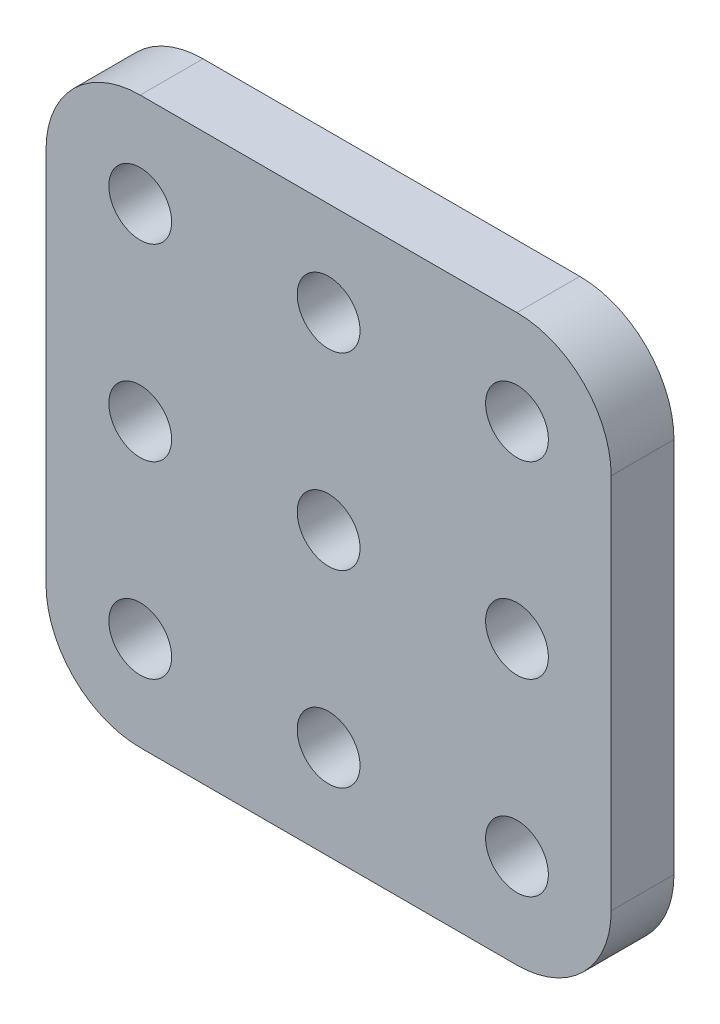
ISO-10303-21;
HEADER;
FILE_DESCRIPTION(('STEP AP214'),'2;1');
FILE_NAME('part.step','',(''),(''),'','','');
FILE_SCHEMA(('AUTOMOTIVE_DESIGN { 1 0 10303 214 1 1 1 1 }'));
ENDSEC;
DATA;
#1=APPLICATION_CONTEXT('core data for automotive mechanical design processes');
#2=APPLICATION_PROTOCOL_DEFINITION('international standard','automotive_design',2000,#1);
#3=PRODUCT_CONTEXT('',#1,'mechanical');
#4=PRODUCT('Part','Part','',(#3));
#5=PRODUCT_RELATED_PRODUCT_CATEGORY('part','',(#4));
#6=PRODUCT_DEFINITION_FORMATION('','',#4);
#7=PRODUCT_DEFINITION_CONTEXT('part definition',#1,'design');
#8=PRODUCT_DEFINITION('design','',#6,#7);
#9=PRODUCT_DEFINITION_SHAPE('','',#8);
#10=(LENGTH_UNIT() NAMED_UNIT(*) SI_UNIT(.MILLI.,.METRE.));
#11=(NAMED_UNIT(*) PLANE_ANGLE_UNIT() SI_UNIT($,.RADIAN.));
#12=(NAMED_UNIT(*) SI_UNIT($,.STERADIAN.) SOLID_ANGLE_UNIT());
#13=UNCERTAINTY_MEASURE_WITH_UNIT(LENGTH_MEASURE(1.E-05),#10,'distance_accuracy_value','');
#14=(GEOMETRIC_REPRESENTATION_CONTEXT(3) GLOBAL_UNCERTAINTY_ASSIGNED_CONTEXT((#13)) GLOBAL_UNIT_ASSIGNED_CONTEXT((#10,
#11,#12)) REPRESENTATION_CONTEXT('',''));
#15=CARTESIAN_POINT('',(0.,0.,0.));
#16=DIRECTION('',(0.,0.,1.));
#17=DIRECTION('',(1.,0.,0.));
#18=AXIS2_PLACEMENT_3D('',#15,#16,#17);
#19=CARTESIAN_POINT('',(-101.443383637,101.056539338,3.));
#20=DIRECTION('',(0.,0.,1.));
#21=DIRECTION('',(1.,0.,0.));
#22=AXIS2_PLACEMENT_3D('',#19,#20,#21);
#23=PLANE('',#22);
#24=CARTESIAN_POINT('',(-92.443383637,83.056539338,3.));
#25=DIRECTION('',(0.,0.,1.));
#26=DIRECTION('',(1.,0.,0.));
#27=AXIS2_PLACEMENT_3D('',#24,#25,#26);
#28=CIRCLE('',#27,1.5);
#29=CARTESIAN_POINT('',(-90.943383637,83.056539338,3.));
#30=VERTEX_POINT('',#29);
#31=EDGE_CURVE('E218',#30,#30,#28,.T.);
#32=ORIENTED_EDGE('',*,*,#31,.F.);
#33=EDGE_LOOP('',(#32));
#34=FACE_BOUND('',#33,.T.);
#35=CARTESIAN_POINT('',(-83.443383637,92.056539338,3.));
#36=DIRECTION('',(0.,0.,1.));
#37=DIRECTION('',(1.,0.,0.));
#38=AXIS2_PLACEMENT_3D('',#35,#36,#37);
#39=CIRCLE('',#38,1.5);
#40=CARTESIAN_POINT('',(-81.943383637,92.056539338,3.));
#41=VERTEX_POINT('',#40);
#42=EDGE_CURVE('E206',#41,#41,#39,.T.);
#43=ORIENTED_EDGE('',*,*,#42,.F.);
#44=EDGE_LOOP('',(#43));
#45=FACE_BOUND('',#44,.T.);
#46=CARTESIAN_POINT('',(-101.443383637,92.056539338,3.));
#47=DIRECTION('',(0.,0.,1.));
#48=DIRECTION('',(1.,0.,0.));
#49=AXIS2_PLACEMENT_3D('',#46,#47,#48);
#50=CIRCLE('',#49,1.5);
#51=CARTESIAN_POINT('',(-99.943383637,92.056539338,3.));
#52=VERTEX_POINT('',#51);
#53=EDGE_CURVE('E194',#52,#52,#50,.T.);
#54=ORIENTED_EDGE('',*,*,#53,.F.);
#55=EDGE_LOOP('',(#54));
#56=FACE_BOUND('',#55,.T.);
#57=CARTESIAN_POINT('',(-92.443383637,101.056539338,3.));
#58=DIRECTION('',(0.,0.,1.));
#59=DIRECTION('',(1.,0.,0.));
#60=AXIS2_PLACEMENT_3D('',#57,#58,#59);
#61=CIRCLE('',#60,1.5);
#62=CARTESIAN_POINT('',(-90.943383637,101.056539338,3.));
#63=VERTEX_POINT('',#62);
#64=EDGE_CURVE('E182',#63,#63,#61,.T.);
#65=ORIENTED_EDGE('',*,*,#64,.F.);
#66=EDGE_LOOP('',(#65));
#67=FACE_BOUND('',#66,.T.);
#68=CARTESIAN_POINT('',(-101.443383637,101.056539338,3.));
#69=DIRECTION('',(0.,0.,1.));
#70=DIRECTION('',(1.,0.,0.));
#71=AXIS2_PLACEMENT_3D('',#68,#69,#70);
#72=CIRCLE('',#71,4.5);
#73=CARTESIAN_POINT('',(-101.443383637,105.556539338,3.));
#74=VERTEX_POINT('',#73);
#75=CARTESIAN_POINT('',(-105.943383637,101.056539338,3.));
#76=VERTEX_POINT('',#75);
#77=EDGE_CURVE('E145',#74,#76,#72,.T.);
#78=ORIENTED_EDGE('',*,*,#77,.T.);
#79=DIRECTION('',(0.,-1.,0.));
#80=VECTOR('',#79,1.);
#81=CARTESIAN_POINT('',(-105.943383637,101.056539338,3.));
#82=LINE('',#81,#80);
#83=CARTESIAN_POINT('',(-105.943383637,83.056539338,3.));
#84=VERTEX_POINT('',#83);
#85=EDGE_CURVE('E93',#76,#84,#82,.T.);
#86=ORIENTED_EDGE('',*,*,#85,.T.);
#87=CARTESIAN_POINT('',(-101.443383637,83.056539338,3.));
#88=DIRECTION('',(0.,0.,1.));
#89=DIRECTION('',(1.,0.,0.));
#90=AXIS2_PLACEMENT_3D('',#87,#88,#89);
#91=CIRCLE('',#90,4.5);
#92=CARTESIAN_POINT('',(-101.443383637,78.556539338,3.));
#93=VERTEX_POINT('',#92);
#94=EDGE_CURVE('E160',#84,#93,#91,.T.);
#95=ORIENTED_EDGE('',*,*,#94,.T.);
#96=DIRECTION('',(1.,0.,0.));
#97=VECTOR('',#96,1.);
#98=CARTESIAN_POINT('',(-101.443383637,78.556539338,3.));
#99=LINE('',#98,#97);
#100=CARTESIAN_POINT('',(-83.443383637,78.556539338,3.));
#101=VERTEX_POINT('',#100);
#102=EDGE_CURVE('E173',#93,#101,#99,.T.);
#103=ORIENTED_EDGE('',*,*,#102,.T.);
#104=CARTESIAN_POINT('',(-83.443383637,83.056539338,3.));
#105=DIRECTION('',(0.,0.,1.));
#106=DIRECTION('',(1.,0.,0.));
#107=AXIS2_PLACEMENT_3D('',#104,#105,#106);
#108=CIRCLE('',#107,4.5);
#109=CARTESIAN_POINT('',(-78.943383637,83.056539338,3.));
#110=VERTEX_POINT('',#109);
#111=EDGE_CURVE('E112',#101,#110,#108,.T.);
#112=ORIENTED_EDGE('',*,*,#111,.T.);
#113=DIRECTION('',(0.,1.,0.));
#114=VECTOR('',#113,1.);
#115=CARTESIAN_POINT('',(-78.943383637,83.056539338,3.));
#116=LINE('',#115,#114);
#117=CARTESIAN_POINT('',(-78.943383637,101.056539338,3.));
#118=VERTEX_POINT('',#117);
#119=EDGE_CURVE('E106',#110,#118,#116,.T.);
#120=ORIENTED_EDGE('',*,*,#119,.T.);
#121=CARTESIAN_POINT('',(-83.443383637,101.056539338,3.));
#122=DIRECTION('',(0.,0.,1.));
#123=DIRECTION('',(1.,0.,0.));
#124=AXIS2_PLACEMENT_3D('',#121,#122,#123);
#125=CIRCLE('',#124,4.5);
#126=CARTESIAN_POINT('',(-83.443383637,105.556539338,3.));
#127=VERTEX_POINT('',#126);
#128=EDGE_CURVE('E110',#118,#127,#125,.T.);
#129=ORIENTED_EDGE('',*,*,#128,.T.);
#130=DIRECTION('',(-1.,0.,0.));
#131=VECTOR('',#130,1.);
#132=CARTESIAN_POINT('',(-83.443383637,105.556539338,3.));
#133=LINE('',#132,#131);
#134=EDGE_CURVE('E50',#127,#74,#133,.T.);
#135=ORIENTED_EDGE('',*,*,#134,.T.);
#136=EDGE_LOOP('',(#78,#86,#95,#103,#112,#120,#129,#135));
#137=FACE_BOUND('',#136,.T.);
#138=CARTESIAN_POINT('',(-101.443383637,101.056539338,3.));
#139=DIRECTION('',(0.,0.,1.));
#140=DIRECTION('',(1.,0.,0.));
#141=AXIS2_PLACEMENT_3D('',#138,#139,#140);
#142=CIRCLE('',#141,1.5);
#143=CARTESIAN_POINT('',(-99.943383637,101.056539338,3.));
#144=VERTEX_POINT('',#143);
#145=EDGE_CURVE('E134',#144,#144,#142,.T.);
#146=ORIENTED_EDGE('',*,*,#145,.F.);
#147=EDGE_LOOP('',(#146));
#148=FACE_BOUND('',#147,.T.);
#149=CARTESIAN_POINT('',(-83.443383637,101.056539338,3.));
#150=DIRECTION('',(0.,0.,1.));
#151=DIRECTION('',(1.,0.,0.));
#152=AXIS2_PLACEMENT_3D('',#149,#150,#151);
#153=CIRCLE('',#152,1.5);
#154=CARTESIAN_POINT('',(-81.943383637,101.056539338,3.));
#155=VERTEX_POINT('',#154);
#156=EDGE_CURVE('E188',#155,#155,#153,.T.);
#157=ORIENTED_EDGE('',*,*,#156,.F.);
#158=EDGE_LOOP('',(#157));
#159=FACE_BOUND('',#158,.T.);
#160=CARTESIAN_POINT('',(-92.443383637,92.056539338,3.));
#161=DIRECTION('',(0.,0.,1.));
#162=DIRECTION('',(1.,0.,0.));
#163=AXIS2_PLACEMENT_3D('',#160,#161,#162);
#164=CIRCLE('',#163,1.5);
#165=CARTESIAN_POINT('',(-90.943383637,92.056539338,3.));
#166=VERTEX_POINT('',#165);
#167=EDGE_CURVE('E200',#166,#166,#164,.T.);
#168=ORIENTED_EDGE('',*,*,#167,.F.);
#169=EDGE_LOOP('',(#168));
#170=FACE_BOUND('',#169,.T.);
#171=CARTESIAN_POINT('',(-101.443383637,83.056539338,3.));
#172=DIRECTION('',(0.,0.,1.));
#173=DIRECTION('',(1.,0.,0.));
#174=AXIS2_PLACEMENT_3D('',#171,#172,#173);
#175=CIRCLE('',#174,1.5);
#176=CARTESIAN_POINT('',(-99.943383637,83.056539338,3.));
#177=VERTEX_POINT('',#176);
#178=EDGE_CURVE('E212',#177,#177,#175,.T.);
#179=ORIENTED_EDGE('',*,*,#178,.F.);
#180=EDGE_LOOP('',(#179));
#181=FACE_BOUND('',#180,.T.);
#182=CARTESIAN_POINT('',(-83.443383637,83.056539338,3.));
#183=DIRECTION('',(0.,0.,1.));
#184=DIRECTION('',(1.,0.,0.));
#185=AXIS2_PLACEMENT_3D('',#182,#183,#184);
#186=CIRCLE('',#185,1.5);
#187=CARTESIAN_POINT('',(-81.943383637,83.056539338,3.));
#188=VERTEX_POINT('',#187);
#189=EDGE_CURVE('E224',#188,#188,#186,.T.);
#190=ORIENTED_EDGE('',*,*,#189,.F.);
#191=EDGE_LOOP('',(#190));
#192=FACE_BOUND('',#191,.T.);
#193=ADVANCED_FACE('F33',(#34,#45,#56,#67,#137,#148,#159,#170,#181,#192),#23,.T.);
#194=CARTESIAN_POINT('',(-101.443383637,101.056539338,0.));
#195=DIRECTION('',(0.,0.,1.));
#196=DIRECTION('',(1.,0.,0.));
#197=AXIS2_PLACEMENT_3D('',#194,#195,#196);
#198=PLANE('',#197);
#199=CARTESIAN_POINT('',(-92.443383637,83.056539338,0.));
#200=DIRECTION('',(0.,0.,1.));
#201=DIRECTION('',(1.,0.,0.));
#202=AXIS2_PLACEMENT_3D('',#199,#200,#201);
#203=CIRCLE('',#202,1.5);
#204=CARTESIAN_POINT('',(-90.943383637,83.056539338,0.));
#205=VERTEX_POINT('',#204);
#206=EDGE_CURVE('E221',#205,#205,#203,.T.);
#207=ORIENTED_EDGE('',*,*,#206,.T.);
#208=EDGE_LOOP('',(#207));
#209=FACE_BOUND('',#208,.T.);
#210=CARTESIAN_POINT('',(-83.443383637,92.056539338,0.));
#211=DIRECTION('',(0.,0.,1.));
#212=DIRECTION('',(1.,0.,0.));
#213=AXIS2_PLACEMENT_3D('',#210,#211,#212);
#214=CIRCLE('',#213,1.5);
#215=CARTESIAN_POINT('',(-81.943383637,92.056539338,0.));
#216=VERTEX_POINT('',#215);
#217=EDGE_CURVE('E209',#216,#216,#214,.T.);
#218=ORIENTED_EDGE('',*,*,#217,.T.);
#219=EDGE_LOOP('',(#218));
#220=FACE_BOUND('',#219,.T.);
#221=CARTESIAN_POINT('',(-101.443383637,92.056539338,0.));
#222=DIRECTION('',(0.,0.,1.));
#223=DIRECTION('',(1.,0.,0.));
#224=AXIS2_PLACEMENT_3D('',#221,#222,#223);
#225=CIRCLE('',#224,1.5);
#226=CARTESIAN_POINT('',(-99.943383637,92.056539338,0.));
#227=VERTEX_POINT('',#226);
#228=EDGE_CURVE('E197',#227,#227,#225,.T.);
#229=ORIENTED_EDGE('',*,*,#228,.T.);
#230=EDGE_LOOP('',(#229));
#231=FACE_BOUND('',#230,.T.);
#232=CARTESIAN_POINT('',(-92.443383637,101.056539338,0.));
#233=DIRECTION('',(0.,0.,1.));
#234=DIRECTION('',(1.,0.,0.));
#235=AXIS2_PLACEMENT_3D('',#232,#233,#234);
#236=CIRCLE('',#235,1.5);
#237=CARTESIAN_POINT('',(-90.943383637,101.056539338,0.));
#238=VERTEX_POINT('',#237);
#239=EDGE_CURVE('E185',#238,#238,#236,.T.);
#240=ORIENTED_EDGE('',*,*,#239,.T.);
#241=EDGE_LOOP('',(#240));
#242=FACE_BOUND('',#241,.T.);
#243=CARTESIAN_POINT('',(-101.443383637,101.056539338,0.));
#244=DIRECTION('',(0.,0.,1.));
#245=DIRECTION('',(1.,0.,0.));
#246=AXIS2_PLACEMENT_3D('',#243,#244,#245);
#247=CIRCLE('',#246,4.5);
#248=CARTESIAN_POINT('',(-101.443383637,105.556539338,0.));
#249=VERTEX_POINT('',#248);
#250=CARTESIAN_POINT('',(-105.943383637,101.056539338,0.));
#251=VERTEX_POINT('',#250);
#252=EDGE_CURVE('E130',#249,#251,#247,.T.);
#253=ORIENTED_EDGE('',*,*,#252,.F.);
#254=DIRECTION('',(-1.,0.,0.));
#255=VECTOR('',#254,1.);
#256=CARTESIAN_POINT('',(-83.443383637,105.556539338,0.));
#257=LINE('',#256,#255);
#258=CARTESIAN_POINT('',(-83.443383637,105.556539338,0.));
#259=VERTEX_POINT('',#258);
#260=EDGE_CURVE('E85',#259,#249,#257,.T.);
#261=ORIENTED_EDGE('',*,*,#260,.F.);
#262=CARTESIAN_POINT('',(-83.443383637,101.056539338,0.));
#263=DIRECTION('',(0.,0.,1.));
#264=DIRECTION('',(1.,0.,0.));
#265=AXIS2_PLACEMENT_3D('',#262,#263,#264);
#266=CIRCLE('',#265,4.5);
#267=CARTESIAN_POINT('',(-78.943383637,101.056539338,0.));
#268=VERTEX_POINT('',#267);
#269=EDGE_CURVE('E79',#268,#259,#266,.T.);
#270=ORIENTED_EDGE('',*,*,#269,.F.);
#271=DIRECTION('',(0.,1.,0.));
#272=VECTOR('',#271,1.);
#273=CARTESIAN_POINT('',(-78.943383637,83.056539338,0.));
#274=LINE('',#273,#272);
#275=CARTESIAN_POINT('',(-78.943383637,83.056539338,0.));
#276=VERTEX_POINT('',#275);
#277=EDGE_CURVE('E120',#276,#268,#274,.T.);
#278=ORIENTED_EDGE('',*,*,#277,.F.);
#279=CARTESIAN_POINT('',(-83.443383637,83.056539338,0.));
#280=DIRECTION('',(0.,0.,1.));
#281=DIRECTION('',(1.,0.,0.));
#282=AXIS2_PLACEMENT_3D('',#279,#280,#281);
#283=CIRCLE('',#282,4.5);
#284=CARTESIAN_POINT('',(-83.443383637,78.556539338,0.));
#285=VERTEX_POINT('',#284);
#286=EDGE_CURVE('E140',#285,#276,#283,.T.);
#287=ORIENTED_EDGE('',*,*,#286,.F.);
#288=DIRECTION('',(1.,0.,0.));
#289=VECTOR('',#288,1.);
#290=CARTESIAN_POINT('',(-101.443383637,78.556539338,0.));
#291=LINE('',#290,#289);
#292=CARTESIAN_POINT('',(-101.443383637,78.556539338,0.));
#293=VERTEX_POINT('',#292);
#294=EDGE_CURVE('E138',#293,#285,#291,.T.);
#295=ORIENTED_EDGE('',*,*,#294,.F.);
#296=CARTESIAN_POINT('',(-101.443383637,83.056539338,0.));
#297=DIRECTION('',(0.,0.,1.));
#298=DIRECTION('',(1.,0.,0.));
#299=AXIS2_PLACEMENT_3D('',#296,#297,#298);
#300=CIRCLE('',#299,4.5);
#301=CARTESIAN_POINT('',(-105.943383637,83.056539338,0.));
#302=VERTEX_POINT('',#301);
#303=EDGE_CURVE('E136',#302,#293,#300,.T.);
#304=ORIENTED_EDGE('',*,*,#303,.F.);
#305=DIRECTION('',(0.,-1.,0.));
#306=VECTOR('',#305,1.);
#307=CARTESIAN_POINT('',(-105.943383637,101.056539338,0.));
#308=LINE('',#307,#306);
#309=EDGE_CURVE('E133',#251,#302,#308,.T.);
#310=ORIENTED_EDGE('',*,*,#309,.F.);
#311=EDGE_LOOP('',(#253,#261,#270,#278,#287,#295,#304,#310));
#312=FACE_BOUND('',#311,.T.);
#313=CARTESIAN_POINT('',(-101.443383637,101.056539338,0.));
#314=DIRECTION('',(0.,0.,1.));
#315=DIRECTION('',(1.,0.,0.));
#316=AXIS2_PLACEMENT_3D('',#313,#314,#315);
#317=CIRCLE('',#316,1.5);
#318=CARTESIAN_POINT('',(-99.943383637,101.056539338,0.));
#319=VERTEX_POINT('',#318);
#320=EDGE_CURVE('E179',#319,#319,#317,.T.);
#321=ORIENTED_EDGE('',*,*,#320,.T.);
#322=EDGE_LOOP('',(#321));
#323=FACE_BOUND('',#322,.T.);
#324=CARTESIAN_POINT('',(-83.443383637,101.056539338,0.));
#325=DIRECTION('',(0.,0.,1.));
#326=DIRECTION('',(1.,0.,0.));
#327=AXIS2_PLACEMENT_3D('',#324,#325,#326);
#328=CIRCLE('',#327,1.5);
#329=CARTESIAN_POINT('',(-81.943383637,101.056539338,0.));
#330=VERTEX_POINT('',#329);
#331=EDGE_CURVE('E191',#330,#330,#328,.T.);
#332=ORIENTED_EDGE('',*,*,#331,.T.);
#333=EDGE_LOOP('',(#332));
#334=FACE_BOUND('',#333,.T.);
#335=CARTESIAN_POINT('',(-92.443383637,92.056539338,0.));
#336=DIRECTION('',(0.,0.,1.));
#337=DIRECTION('',(1.,0.,0.));
#338=AXIS2_PLACEMENT_3D('',#335,#336,#337);
#339=CIRCLE('',#338,1.5);
#340=CARTESIAN_POINT('',(-90.943383637,92.056539338,0.));
#341=VERTEX_POINT('',#340);
#342=EDGE_CURVE('E203',#341,#341,#339,.T.);
#343=ORIENTED_EDGE('',*,*,#342,.T.);
#344=EDGE_LOOP('',(#343));
#345=FACE_BOUND('',#344,.T.);
#346=CARTESIAN_POINT('',(-101.443383637,83.056539338,0.));
#347=DIRECTION('',(0.,0.,1.));
#348=DIRECTION('',(1.,0.,0.));
#349=AXIS2_PLACEMENT_3D('',#346,#347,#348);
#350=CIRCLE('',#349,1.5);
#351=CARTESIAN_POINT('',(-99.943383637,83.056539338,0.));
#352=VERTEX_POINT('',#351);
#353=EDGE_CURVE('E215',#352,#352,#350,.T.);
#354=ORIENTED_EDGE('',*,*,#353,.T.);
#355=EDGE_LOOP('',(#354));
#356=FACE_BOUND('',#355,.T.);
#357=CARTESIAN_POINT('',(-83.443383637,83.056539338,0.));
#358=DIRECTION('',(0.,0.,1.));
#359=DIRECTION('',(1.,0.,0.));
#360=AXIS2_PLACEMENT_3D('',#357,#358,#359);
#361=CIRCLE('',#360,1.5);
#362=CARTESIAN_POINT('',(-81.943383637,83.056539338,0.));
#363=VERTEX_POINT('',#362);
#364=EDGE_CURVE('E227',#363,#363,#361,.T.);
#365=ORIENTED_EDGE('',*,*,#364,.T.);
#366=EDGE_LOOP('',(#365));
#367=FACE_BOUND('',#366,.T.);
#368=ADVANCED_FACE('F164',(#209,#220,#231,#242,#312,#323,#334,#345,#356,#367),#198,.F.);
#369=CARTESIAN_POINT('',(-101.443383637,101.056539338,3.));
#370=DIRECTION('',(0.,0.,-1.));
#371=DIRECTION('',(-1.,0.,0.));
#372=AXIS2_PLACEMENT_3D('',#369,#370,#371);
#373=CYLINDRICAL_SURFACE('',#372,4.5);
#374=ORIENTED_EDGE('',*,*,#252,.T.);
#375=DIRECTION('',(0.,0.,-1.));
#376=VECTOR('',#375,1.);
#377=CARTESIAN_POINT('',(-105.943383637,101.056539338,3.));
#378=LINE('',#377,#376);
#379=EDGE_CURVE('E11',#76,#251,#378,.T.);
#380=ORIENTED_EDGE('',*,*,#379,.F.);
#381=ORIENTED_EDGE('',*,*,#77,.F.);
#382=DIRECTION('',(0.,0.,-1.));
#383=VECTOR('',#382,1.);
#384=CARTESIAN_POINT('',(-101.443383637,105.556539338,3.));
#385=LINE('',#384,#383);
#386=EDGE_CURVE('E126',#74,#249,#385,.T.);
#387=ORIENTED_EDGE('',*,*,#386,.T.);
#388=EDGE_LOOP('',(#374,#380,#381,#387));
#389=FACE_BOUND('',#388,.T.);
#390=ADVANCED_FACE('F35',(#389),#373,.T.);
#391=CARTESIAN_POINT('',(-105.943383637,101.056539338,3.));
#392=DIRECTION('',(1.,0.,0.));
#393=DIRECTION('',(0.,0.,-1.));
#394=AXIS2_PLACEMENT_3D('',#391,#392,#393);
#395=PLANE('',#394);
#396=ORIENTED_EDGE('',*,*,#309,.T.);
#397=DIRECTION('',(0.,0.,-1.));
#398=VECTOR('',#397,1.);
#399=CARTESIAN_POINT('',(-105.943383637,83.056539338,3.));
#400=LINE('',#399,#398);
#401=EDGE_CURVE('E42',#84,#302,#400,.T.);
#402=ORIENTED_EDGE('',*,*,#401,.F.);
#403=ORIENTED_EDGE('',*,*,#85,.F.);
#404=ORIENTED_EDGE('',*,*,#379,.T.);
#405=EDGE_LOOP('',(#396,#402,#403,#404));
#406=FACE_BOUND('',#405,.T.);
#407=ADVANCED_FACE('F262',(#406),#395,.F.);
#408=CARTESIAN_POINT('',(-101.443383637,83.056539338,3.));
#409=DIRECTION('',(0.,0.,-1.));
#410=DIRECTION('',(-1.,0.,0.));
#411=AXIS2_PLACEMENT_3D('',#408,#409,#410);
#412=CYLINDRICAL_SURFACE('',#411,4.5);
#413=ORIENTED_EDGE('',*,*,#303,.T.);
#414=DIRECTION('',(0.,0.,-1.));
#415=VECTOR('',#414,1.);
#416=CARTESIAN_POINT('',(-101.443383637,78.556539338,3.));
#417=LINE('',#416,#415);
#418=EDGE_CURVE('E152',#93,#293,#417,.T.);
#419=ORIENTED_EDGE('',*,*,#418,.F.);
#420=ORIENTED_EDGE('',*,*,#94,.F.);
#421=ORIENTED_EDGE('',*,*,#401,.T.);
#422=EDGE_LOOP('',(#413,#419,#420,#421));
#423=FACE_BOUND('',#422,.T.);
#424=ADVANCED_FACE('F158',(#423),#412,.T.);
#425=CARTESIAN_POINT('',(-101.443383637,78.556539338,3.));
#426=DIRECTION('',(0.,1.,0.));
#427=DIRECTION('',(0.,0.,1.));
#428=AXIS2_PLACEMENT_3D('',#425,#426,#427);
#429=PLANE('',#428);
#430=ORIENTED_EDGE('',*,*,#294,.T.);
#431=DIRECTION('',(0.,0.,-1.));
#432=VECTOR('',#431,1.);
#433=CARTESIAN_POINT('',(-83.443383637,78.556539338,3.));
#434=LINE('',#433,#432);
#435=EDGE_CURVE('E149',#101,#285,#434,.T.);
#436=ORIENTED_EDGE('',*,*,#435,.F.);
#437=ORIENTED_EDGE('',*,*,#102,.F.);
#438=ORIENTED_EDGE('',*,*,#418,.T.);
#439=EDGE_LOOP('',(#430,#436,#437,#438));
#440=FACE_BOUND('',#439,.T.);
#441=ADVANCED_FACE('F169',(#440),#429,.F.);
#442=CARTESIAN_POINT('',(-83.443383637,83.056539338,3.));
#443=DIRECTION('',(0.,0.,-1.));
#444=DIRECTION('',(-1.,0.,0.));
#445=AXIS2_PLACEMENT_3D('',#442,#443,#444);
#446=CYLINDRICAL_SURFACE('',#445,4.5);
#447=ORIENTED_EDGE('',*,*,#286,.T.);
#448=DIRECTION('',(0.,0.,-1.));
#449=VECTOR('',#448,1.);
#450=CARTESIAN_POINT('',(-78.943383637,83.056539338,3.));
#451=LINE('',#450,#449);
#452=EDGE_CURVE('E121',#110,#276,#451,.T.);
#453=ORIENTED_EDGE('',*,*,#452,.F.);
#454=ORIENTED_EDGE('',*,*,#111,.F.);
#455=ORIENTED_EDGE('',*,*,#435,.T.);
#456=EDGE_LOOP('',(#447,#453,#454,#455));
#457=FACE_BOUND('',#456,.T.);
#458=ADVANCED_FACE('F172',(#457),#446,.T.);
#459=CARTESIAN_POINT('',(-78.943383637,83.056539338,3.));
#460=DIRECTION('',(-1.,0.,0.));
#461=DIRECTION('',(0.,0.,1.));
#462=AXIS2_PLACEMENT_3D('',#459,#460,#461);
#463=PLANE('',#462);
#464=ORIENTED_EDGE('',*,*,#277,.T.);
#465=DIRECTION('',(0.,0.,-1.));
#466=VECTOR('',#465,1.);
#467=CARTESIAN_POINT('',(-78.943383637,101.056539338,3.));
#468=LINE('',#467,#466);
#469=EDGE_CURVE('E117',#118,#268,#468,.T.);
#470=ORIENTED_EDGE('',*,*,#469,.F.);
#471=ORIENTED_EDGE('',*,*,#119,.F.);
#472=ORIENTED_EDGE('',*,*,#452,.T.);
#473=EDGE_LOOP('',(#464,#470,#471,#472));
#474=FACE_BOUND('',#473,.T.);
#475=ADVANCED_FACE('F118',(#474),#463,.F.);
#476=CARTESIAN_POINT('',(-83.443383637,101.056539338,3.));
#477=DIRECTION('',(0.,0.,-1.));
#478=DIRECTION('',(-1.,0.,0.));
#479=AXIS2_PLACEMENT_3D('',#476,#477,#478);
#480=CYLINDRICAL_SURFACE('',#479,4.5);
#481=ORIENTED_EDGE('',*,*,#269,.T.);
#482=DIRECTION('',(0.,0.,-1.));
#483=VECTOR('',#482,1.);
#484=CARTESIAN_POINT('',(-83.443383637,105.556539338,3.));
#485=LINE('',#484,#483);
#486=EDGE_CURVE('E122',#127,#259,#485,.T.);
#487=ORIENTED_EDGE('',*,*,#486,.F.);
#488=ORIENTED_EDGE('',*,*,#128,.F.);
#489=ORIENTED_EDGE('',*,*,#469,.T.);
#490=EDGE_LOOP('',(#481,#487,#488,#489));
#491=FACE_BOUND('',#490,.T.);
#492=ADVANCED_FACE('F124',(#491),#480,.T.);
#493=CARTESIAN_POINT('',(-83.443383637,105.556539338,3.));
#494=DIRECTION('',(0.,-1.,0.));
#495=DIRECTION('',(0.,0.,-1.));
#496=AXIS2_PLACEMENT_3D('',#493,#494,#495);
#497=PLANE('',#496);
#498=ORIENTED_EDGE('',*,*,#260,.T.);
#499=ORIENTED_EDGE('',*,*,#386,.F.);
#500=ORIENTED_EDGE('',*,*,#134,.F.);
#501=ORIENTED_EDGE('',*,*,#486,.T.);
#502=EDGE_LOOP('',(#498,#499,#500,#501));
#503=FACE_BOUND('',#502,.T.);
#504=ADVANCED_FACE('F250',(#503),#497,.F.);
#505=CARTESIAN_POINT('',(-101.443383637,101.056539338,3.));
#506=DIRECTION('',(0.,0.,-1.));
#507=DIRECTION('',(-1.,0.,0.));
#508=AXIS2_PLACEMENT_3D('',#505,#506,#507);
#509=CYLINDRICAL_SURFACE('',#508,1.5);
#510=ORIENTED_EDGE('',*,*,#145,.T.);
#511=EDGE_LOOP('',(#510));
#512=FACE_BOUND('',#511,.T.);
#513=ORIENTED_EDGE('',*,*,#320,.F.);
#514=EDGE_LOOP('',(#513));
#515=FACE_BOUND('',#514,.T.);
#516=ADVANCED_FACE('F247',(#512,#515),#509,.F.);
#517=CARTESIAN_POINT('',(-92.443383637,101.056539338,3.));
#518=DIRECTION('',(0.,0.,-1.));
#519=DIRECTION('',(-1.,0.,0.));
#520=AXIS2_PLACEMENT_3D('',#517,#518,#519);
#521=CYLINDRICAL_SURFACE('',#520,1.5);
#522=ORIENTED_EDGE('',*,*,#64,.T.);
#523=EDGE_LOOP('',(#522));
#524=FACE_BOUND('',#523,.T.);
#525=ORIENTED_EDGE('',*,*,#239,.F.);
#526=EDGE_LOOP('',(#525));
#527=FACE_BOUND('',#526,.T.);
#528=ADVANCED_FACE('F326',(#524,#527),#521,.F.);
#529=CARTESIAN_POINT('',(-83.443383637,101.056539338,3.));
#530=DIRECTION('',(0.,0.,-1.));
#531=DIRECTION('',(-1.,0.,0.));
#532=AXIS2_PLACEMENT_3D('',#529,#530,#531);
#533=CYLINDRICAL_SURFACE('',#532,1.5);
#534=ORIENTED_EDGE('',*,*,#156,.T.);
#535=EDGE_LOOP('',(#534));
#536=FACE_BOUND('',#535,.T.);
#537=ORIENTED_EDGE('',*,*,#331,.F.);
#538=EDGE_LOOP('',(#537));
#539=FACE_BOUND('',#538,.T.);
#540=ADVANCED_FACE('F334',(#536,#539),#533,.F.);
#541=CARTESIAN_POINT('',(-101.443383637,92.056539338,3.));
#542=DIRECTION('',(0.,0.,-1.));
#543=DIRECTION('',(-1.,0.,0.));
#544=AXIS2_PLACEMENT_3D('',#541,#542,#543);
#545=CYLINDRICAL_SURFACE('',#544,1.5);
#546=ORIENTED_EDGE('',*,*,#53,.T.);
#547=EDGE_LOOP('',(#546));
#548=FACE_BOUND('',#547,.T.);
#549=ORIENTED_EDGE('',*,*,#228,.F.);
#550=EDGE_LOOP('',(#549));
#551=FACE_BOUND('',#550,.T.);
#552=ADVANCED_FACE('F342',(#548,#551),#545,.F.);
#553=CARTESIAN_POINT('',(-92.443383637,92.056539338,3.));
#554=DIRECTION('',(0.,0.,-1.));
#555=DIRECTION('',(-1.,0.,0.));
#556=AXIS2_PLACEMENT_3D('',#553,#554,#555);
#557=CYLINDRICAL_SURFACE('',#556,1.5);
#558=ORIENTED_EDGE('',*,*,#167,.T.);
#559=EDGE_LOOP('',(#558));
#560=FACE_BOUND('',#559,.T.);
#561=ORIENTED_EDGE('',*,*,#342,.F.);
#562=EDGE_LOOP('',(#561));
#563=FACE_BOUND('',#562,.T.);
#564=ADVANCED_FACE('F351',(#560,#563),#557,.F.);
#565=CARTESIAN_POINT('',(-83.443383637,92.056539338,3.));
#566=DIRECTION('',(0.,0.,-1.));
#567=DIRECTION('',(-1.,0.,0.));
#568=AXIS2_PLACEMENT_3D('',#565,#566,#567);
#569=CYLINDRICAL_SURFACE('',#568,1.5);
#570=ORIENTED_EDGE('',*,*,#42,.T.);
#571=EDGE_LOOP('',(#570));
#572=FACE_BOUND('',#571,.T.);
#573=ORIENTED_EDGE('',*,*,#217,.F.);
#574=EDGE_LOOP('',(#573));
#575=FACE_BOUND('',#574,.T.);
#576=ADVANCED_FACE('F360',(#572,#575),#569,.F.);
#577=CARTESIAN_POINT('',(-101.443383637,83.056539338,3.));
#578=DIRECTION('',(0.,0.,-1.));
#579=DIRECTION('',(-1.,0.,0.));
#580=AXIS2_PLACEMENT_3D('',#577,#578,#579);
#581=CYLINDRICAL_SURFACE('',#580,1.5);
#582=ORIENTED_EDGE('',*,*,#178,.T.);
#583=EDGE_LOOP('',(#582));
#584=FACE_BOUND('',#583,.T.);
#585=ORIENTED_EDGE('',*,*,#353,.F.);
#586=EDGE_LOOP('',(#585));
#587=FACE_BOUND('',#586,.T.);
#588=ADVANCED_FACE('F369',(#584,#587),#581,.F.);
#589=CARTESIAN_POINT('',(-92.443383637,83.056539338,3.));
#590=DIRECTION('',(0.,0.,-1.));
#591=DIRECTION('',(-1.,0.,0.));
#592=AXIS2_PLACEMENT_3D('',#589,#590,#591);
#593=CYLINDRICAL_SURFACE('',#592,1.5);
#594=ORIENTED_EDGE('',*,*,#31,.T.);
#595=EDGE_LOOP('',(#594));
#596=FACE_BOUND('',#595,.T.);
#597=ORIENTED_EDGE('',*,*,#206,.F.);
#598=EDGE_LOOP('',(#597));
#599=FACE_BOUND('',#598,.T.);
#600=ADVANCED_FACE('F378',(#596,#599),#593,.F.);
#601=CARTESIAN_POINT('',(-83.443383637,83.056539338,3.));
#602=DIRECTION('',(0.,0.,-1.));
#603=DIRECTION('',(-1.,0.,0.));
#604=AXIS2_PLACEMENT_3D('',#601,#602,#603);
#605=CYLINDRICAL_SURFACE('',#604,1.5);
#606=ORIENTED_EDGE('',*,*,#189,.T.);
#607=EDGE_LOOP('',(#606));
#608=FACE_BOUND('',#607,.T.);
#609=ORIENTED_EDGE('',*,*,#364,.F.);
#610=EDGE_LOOP('',(#609));
#611=FACE_BOUND('',#610,.T.);
#612=ADVANCED_FACE('F233',(#608,#611),#605,.F.);
#613=CLOSED_SHELL('',(#193,#368,#390,#407,#424,#441,#458,#475,#492,#504,#516,#528,#540,#552,
#564,#576,#588,#600,#612));
#614=MANIFOLD_SOLID_BREP('B2',#613);
#615=ADVANCED_BREP_SHAPE_REPRESENTATION('',(#18,#614),#14);
#616=SHAPE_DEFINITION_REPRESENTATION(#9,#615);
ENDSEC;
END-ISO-10303-21;
